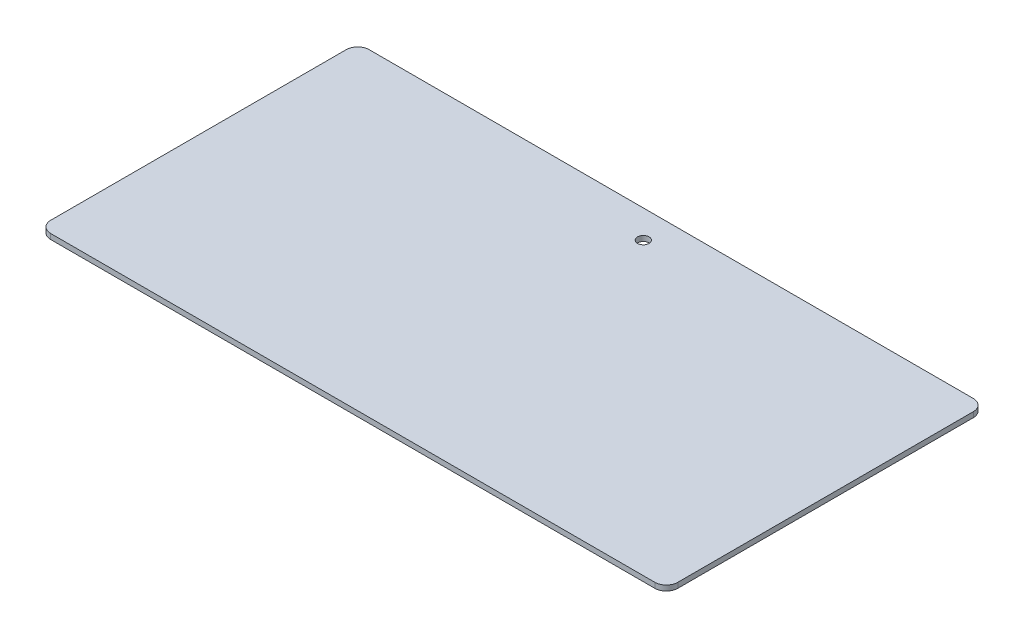
ISO-10303-21;
HEADER;
FILE_DESCRIPTION(('STEP AP214'),'2;1');
FILE_NAME('part.step','',(''),(''),'','','');
FILE_SCHEMA(('AUTOMOTIVE_DESIGN { 1 0 10303 214 1 1 1 1 }'));
ENDSEC;
DATA;
#1=APPLICATION_CONTEXT('core data for automotive mechanical design processes');
#2=APPLICATION_PROTOCOL_DEFINITION('international standard','automotive_design',2000,#1);
#3=PRODUCT_CONTEXT('',#1,'mechanical');
#4=PRODUCT('Part','Part','',(#3));
#5=PRODUCT_RELATED_PRODUCT_CATEGORY('part','',(#4));
#6=PRODUCT_DEFINITION_FORMATION('','',#4);
#7=PRODUCT_DEFINITION_CONTEXT('part definition',#1,'design');
#8=PRODUCT_DEFINITION('design','',#6,#7);
#9=PRODUCT_DEFINITION_SHAPE('','',#8);
#10=(LENGTH_UNIT() NAMED_UNIT(*) SI_UNIT(.MILLI.,.METRE.));
#11=(NAMED_UNIT(*) PLANE_ANGLE_UNIT() SI_UNIT($,.RADIAN.));
#12=(NAMED_UNIT(*) SI_UNIT($,.STERADIAN.) SOLID_ANGLE_UNIT());
#13=UNCERTAINTY_MEASURE_WITH_UNIT(LENGTH_MEASURE(1.E-05),#10,'distance_accuracy_value','');
#14=(GEOMETRIC_REPRESENTATION_CONTEXT(3) GLOBAL_UNCERTAINTY_ASSIGNED_CONTEXT((#13)) GLOBAL_UNIT_ASSIGNED_CONTEXT((#10,
#11,#12)) REPRESENTATION_CONTEXT('',''));
#15=CARTESIAN_POINT('',(0.,0.,0.));
#16=DIRECTION('',(0.,0.,1.));
#17=DIRECTION('',(1.,0.,0.));
#18=AXIS2_PLACEMENT_3D('',#15,#16,#17);
#19=CARTESIAN_POINT('',(229.441389501661,1.6,0.));
#20=DIRECTION('',(0.,0.,-1.));
#21=DIRECTION('',(-1.,0.,0.));
#22=AXIS2_PLACEMENT_3D('',#19,#20,#21);
#23=PLANE('',#22);
#24=DIRECTION('',(1.,0.,0.));
#25=VECTOR('',#24,1.);
#26=CARTESIAN_POINT('',(229.441389501661,1.6,0.));
#27=LINE('',#26,#25);
#28=CARTESIAN_POINT('',(41.9413895016611,1.6,0.));
#29=VERTEX_POINT('',#28);
#30=CARTESIAN_POINT('',(225.941389501661,1.6,0.));
#31=VERTEX_POINT('',#30);
#32=EDGE_CURVE('E128',#29,#31,#27,.T.);
#33=ORIENTED_EDGE('',*,*,#32,.F.);
#34=DIRECTION('',(0.,-1.,0.));
#35=VECTOR('',#34,1.);
#36=CARTESIAN_POINT('',(41.9413895016611,1.6,0.));
#37=LINE('',#36,#35);
#38=CARTESIAN_POINT('',(41.9413895016611,0.,0.));
#39=VERTEX_POINT('',#38);
#40=EDGE_CURVE('E154',#29,#39,#37,.T.);
#41=ORIENTED_EDGE('',*,*,#40,.T.);
#42=DIRECTION('',(1.,0.,0.));
#43=VECTOR('',#42,1.);
#44=CARTESIAN_POINT('',(229.441389501661,0.,0.));
#45=LINE('',#44,#43);
#46=CARTESIAN_POINT('',(225.941389501661,0.,0.));
#47=VERTEX_POINT('',#46);
#48=EDGE_CURVE('E162',#39,#47,#45,.T.);
#49=ORIENTED_EDGE('',*,*,#48,.T.);
#50=DIRECTION('',(0.,-1.,0.));
#51=VECTOR('',#50,1.);
#52=CARTESIAN_POINT('',(225.941389501661,1.6,0.));
#53=LINE('',#52,#51);
#54=EDGE_CURVE('E152',#47,#31,#53,.F.);
#55=ORIENTED_EDGE('',*,*,#54,.T.);
#56=EDGE_LOOP('',(#33,#41,#49,#55));
#57=FACE_BOUND('',#56,.T.);
#58=ADVANCED_FACE('F37',(#57),#23,.F.);
#59=CARTESIAN_POINT('',(229.441389501661,1.6,-97.));
#60=DIRECTION('',(-1.,0.,0.));
#61=DIRECTION('',(0.,0.,1.));
#62=AXIS2_PLACEMENT_3D('',#59,#60,#61);
#63=PLANE('',#62);
#64=DIRECTION('',(0.,0.,-1.));
#65=VECTOR('',#64,1.);
#66=CARTESIAN_POINT('',(229.441389501661,0.,-97.));
#67=LINE('',#66,#65);
#68=CARTESIAN_POINT('',(229.441389501661,0.,-3.50000000000003));
#69=VERTEX_POINT('',#68);
#70=CARTESIAN_POINT('',(229.441389501661,0.,-93.5));
#71=VERTEX_POINT('',#70);
#72=EDGE_CURVE('E133',#69,#71,#67,.T.);
#73=ORIENTED_EDGE('',*,*,#72,.T.);
#74=DIRECTION('',(0.,-1.,0.));
#75=VECTOR('',#74,1.);
#76=CARTESIAN_POINT('',(229.441389501661,1.6,-93.5));
#77=LINE('',#76,#75);
#78=CARTESIAN_POINT('',(229.441389501661,1.6,-93.5));
#79=VERTEX_POINT('',#78);
#80=EDGE_CURVE('E11',#71,#79,#77,.F.);
#81=ORIENTED_EDGE('',*,*,#80,.T.);
#82=DIRECTION('',(0.,0.,-1.));
#83=VECTOR('',#82,1.);
#84=CARTESIAN_POINT('',(229.441389501661,1.6,-97.));
#85=LINE('',#84,#83);
#86=CARTESIAN_POINT('',(229.441389501661,1.6,-3.50000000000003));
#87=VERTEX_POINT('',#86);
#88=EDGE_CURVE('E131',#87,#79,#85,.T.);
#89=ORIENTED_EDGE('',*,*,#88,.F.);
#90=DIRECTION('',(0.,-1.,0.));
#91=VECTOR('',#90,1.);
#92=CARTESIAN_POINT('',(229.441389501661,1.6,-3.5));
#93=LINE('',#92,#91);
#94=EDGE_CURVE('E45',#87,#69,#93,.T.);
#95=ORIENTED_EDGE('',*,*,#94,.T.);
#96=EDGE_LOOP('',(#73,#81,#89,#95));
#97=FACE_BOUND('',#96,.T.);
#98=ADVANCED_FACE('F159',(#97),#63,.F.);
#99=CARTESIAN_POINT('',(38.4413895016611,1.6,-97.));
#100=DIRECTION('',(0.,0.,1.));
#101=DIRECTION('',(1.,0.,0.));
#102=AXIS2_PLACEMENT_3D('',#99,#100,#101);
#103=PLANE('',#102);
#104=DIRECTION('',(-1.,0.,0.));
#105=VECTOR('',#104,1.);
#106=CARTESIAN_POINT('',(38.4413895016611,0.,-97.));
#107=LINE('',#106,#105);
#108=CARTESIAN_POINT('',(225.941389501661,0.,-97.));
#109=VERTEX_POINT('',#108);
#110=CARTESIAN_POINT('',(41.9413895016611,0.,-97.));
#111=VERTEX_POINT('',#110);
#112=EDGE_CURVE('E129',#109,#111,#107,.T.);
#113=ORIENTED_EDGE('',*,*,#112,.T.);
#114=DIRECTION('',(0.,-1.,0.));
#115=VECTOR('',#114,1.);
#116=CARTESIAN_POINT('',(41.9413895016611,1.6,-97.));
#117=LINE('',#116,#115);
#118=CARTESIAN_POINT('',(41.9413895016611,1.6,-97.));
#119=VERTEX_POINT('',#118);
#120=EDGE_CURVE('E107',#111,#119,#117,.F.);
#121=ORIENTED_EDGE('',*,*,#120,.T.);
#122=DIRECTION('',(-1.,0.,0.));
#123=VECTOR('',#122,1.);
#124=CARTESIAN_POINT('',(38.4413895016611,1.6,-97.));
#125=LINE('',#124,#123);
#126=CARTESIAN_POINT('',(225.941389501661,1.6,-97.));
#127=VERTEX_POINT('',#126);
#128=EDGE_CURVE('E167',#127,#119,#125,.T.);
#129=ORIENTED_EDGE('',*,*,#128,.F.);
#130=DIRECTION('',(0.,-1.,0.));
#131=VECTOR('',#130,1.);
#132=CARTESIAN_POINT('',(225.941389501661,1.6,-97.));
#133=LINE('',#132,#131);
#134=EDGE_CURVE('E112',#127,#109,#133,.T.);
#135=ORIENTED_EDGE('',*,*,#134,.T.);
#136=EDGE_LOOP('',(#113,#121,#129,#135));
#137=FACE_BOUND('',#136,.T.);
#138=ADVANCED_FACE('F191',(#137),#103,.F.);
#139=CARTESIAN_POINT('',(38.4413895016611,1.6,0.));
#140=DIRECTION('',(1.,0.,0.));
#141=DIRECTION('',(0.,0.,-1.));
#142=AXIS2_PLACEMENT_3D('',#139,#140,#141);
#143=PLANE('',#142);
#144=DIRECTION('',(0.,0.,1.));
#145=VECTOR('',#144,1.);
#146=CARTESIAN_POINT('',(38.4413895016611,1.6,0.));
#147=LINE('',#146,#145);
#148=CARTESIAN_POINT('',(38.4413895016611,1.6,-93.5));
#149=VERTEX_POINT('',#148);
#150=CARTESIAN_POINT('',(38.4413895016611,1.6,-3.5));
#151=VERTEX_POINT('',#150);
#152=EDGE_CURVE('E122',#149,#151,#147,.T.);
#153=ORIENTED_EDGE('',*,*,#152,.F.);
#154=DIRECTION('',(0.,-1.,0.));
#155=VECTOR('',#154,1.);
#156=CARTESIAN_POINT('',(38.4413895016611,1.6,-93.5));
#157=LINE('',#156,#155);
#158=CARTESIAN_POINT('',(38.4413895016611,0.,-93.5));
#159=VERTEX_POINT('',#158);
#160=EDGE_CURVE('E106',#149,#159,#157,.T.);
#161=ORIENTED_EDGE('',*,*,#160,.T.);
#162=DIRECTION('',(0.,0.,1.));
#163=VECTOR('',#162,1.);
#164=CARTESIAN_POINT('',(38.4413895016611,0.,0.));
#165=LINE('',#164,#163);
#166=CARTESIAN_POINT('',(38.4413895016611,0.,-3.5));
#167=VERTEX_POINT('',#166);
#168=EDGE_CURVE('E119',#159,#167,#165,.T.);
#169=ORIENTED_EDGE('',*,*,#168,.T.);
#170=DIRECTION('',(0.,-1.,0.));
#171=VECTOR('',#170,1.);
#172=CARTESIAN_POINT('',(38.4413895016611,1.6,-3.5));
#173=LINE('',#172,#171);
#174=EDGE_CURVE('E124',#167,#151,#173,.F.);
#175=ORIENTED_EDGE('',*,*,#174,.T.);
#176=EDGE_LOOP('',(#153,#161,#169,#175));
#177=FACE_BOUND('',#176,.T.);
#178=ADVANCED_FACE('F118',(#177),#143,.F.);
#179=CARTESIAN_POINT('',(0.,1.6,0.));
#180=DIRECTION('',(0.,-1.,0.));
#181=DIRECTION('',(0.,0.,-1.));
#182=AXIS2_PLACEMENT_3D('',#179,#180,#181);
#183=PLANE('',#182);
#184=CARTESIAN_POINT('',(133.941389501661,1.6,-88.5));
#185=DIRECTION('',(0.,1.,0.));
#186=DIRECTION('',(0.,0.,1.));
#187=AXIS2_PLACEMENT_3D('',#184,#185,#186);
#188=CIRCLE('',#187,1.75000000000001);
#189=CARTESIAN_POINT('',(133.941389501661,1.6,-86.75));
#190=VERTEX_POINT('',#189);
#191=EDGE_CURVE('E171',#190,#190,#188,.T.);
#192=ORIENTED_EDGE('',*,*,#191,.F.);
#193=EDGE_LOOP('',(#192));
#194=FACE_BOUND('',#193,.T.);
#195=ORIENTED_EDGE('',*,*,#128,.T.);
#196=CARTESIAN_POINT('',(41.9413895016611,1.6,-93.5));
#197=DIRECTION('',(0.,-1.,0.));
#198=DIRECTION('',(0.,0.,-1.));
#199=AXIS2_PLACEMENT_3D('',#196,#197,#198);
#200=CIRCLE('',#199,3.5);
#201=EDGE_CURVE('E150',#119,#149,#200,.F.);
#202=ORIENTED_EDGE('',*,*,#201,.T.);
#203=ORIENTED_EDGE('',*,*,#152,.T.);
#204=CARTESIAN_POINT('',(41.9413895016611,1.6,-3.5));
#205=DIRECTION('',(0.,-1.,0.));
#206=DIRECTION('',(0.,0.,-1.));
#207=AXIS2_PLACEMENT_3D('',#204,#205,#206);
#208=CIRCLE('',#207,3.5);
#209=EDGE_CURVE('E148',#151,#29,#208,.F.);
#210=ORIENTED_EDGE('',*,*,#209,.T.);
#211=ORIENTED_EDGE('',*,*,#32,.T.);
#212=CARTESIAN_POINT('',(225.941389501661,1.6,-3.5));
#213=DIRECTION('',(0.,-1.,0.));
#214=DIRECTION('',(0.,0.,-1.));
#215=AXIS2_PLACEMENT_3D('',#212,#213,#214);
#216=CIRCLE('',#215,3.5);
#217=EDGE_CURVE('E57',#31,#87,#216,.F.);
#218=ORIENTED_EDGE('',*,*,#217,.T.);
#219=ORIENTED_EDGE('',*,*,#88,.T.);
#220=CARTESIAN_POINT('',(225.941389501661,1.6,-93.5));
#221=DIRECTION('',(0.,-1.,0.));
#222=DIRECTION('',(0.,0.,-1.));
#223=AXIS2_PLACEMENT_3D('',#220,#221,#222);
#224=CIRCLE('',#223,3.5);
#225=EDGE_CURVE('E146',#79,#127,#224,.F.);
#226=ORIENTED_EDGE('',*,*,#225,.T.);
#227=EDGE_LOOP('',(#195,#202,#203,#210,#211,#218,#219,#226));
#228=FACE_BOUND('',#227,.T.);
#229=ADVANCED_FACE('F184',(#194,#228),#183,.F.);
#230=CARTESIAN_POINT('',(0.,0.,0.));
#231=DIRECTION('',(0.,-1.,0.));
#232=DIRECTION('',(0.,0.,-1.));
#233=AXIS2_PLACEMENT_3D('',#230,#231,#232);
#234=PLANE('',#233);
#235=CARTESIAN_POINT('',(133.941389501661,0.,-88.5));
#236=DIRECTION('',(0.,1.,0.));
#237=DIRECTION('',(0.,0.,1.));
#238=AXIS2_PLACEMENT_3D('',#235,#236,#237);
#239=CIRCLE('',#238,1.75000000000001);
#240=CARTESIAN_POINT('',(133.941389501661,0.,-86.75));
#241=VERTEX_POINT('',#240);
#242=EDGE_CURVE('E163',#241,#241,#239,.T.);
#243=ORIENTED_EDGE('',*,*,#242,.T.);
#244=EDGE_LOOP('',(#243));
#245=FACE_BOUND('',#244,.T.);
#246=ORIENTED_EDGE('',*,*,#168,.F.);
#247=CARTESIAN_POINT('',(41.9413895016611,0.,-93.5));
#248=DIRECTION('',(0.,-1.,0.));
#249=DIRECTION('',(0.,0.,-1.));
#250=AXIS2_PLACEMENT_3D('',#247,#248,#249);
#251=CIRCLE('',#250,3.5);
#252=EDGE_CURVE('E102',#159,#111,#251,.T.);
#253=ORIENTED_EDGE('',*,*,#252,.T.);
#254=ORIENTED_EDGE('',*,*,#112,.F.);
#255=CARTESIAN_POINT('',(225.941389501661,0.,-93.5));
#256=DIRECTION('',(0.,-1.,0.));
#257=DIRECTION('',(0.,0.,-1.));
#258=AXIS2_PLACEMENT_3D('',#255,#256,#257);
#259=CIRCLE('',#258,3.5);
#260=EDGE_CURVE('E139',#109,#71,#259,.T.);
#261=ORIENTED_EDGE('',*,*,#260,.T.);
#262=ORIENTED_EDGE('',*,*,#72,.F.);
#263=CARTESIAN_POINT('',(225.941389501661,0.,-3.5));
#264=DIRECTION('',(0.,-1.,0.));
#265=DIRECTION('',(0.,0.,-1.));
#266=AXIS2_PLACEMENT_3D('',#263,#264,#265);
#267=CIRCLE('',#266,3.5);
#268=EDGE_CURVE('E123',#69,#47,#267,.T.);
#269=ORIENTED_EDGE('',*,*,#268,.T.);
#270=ORIENTED_EDGE('',*,*,#48,.F.);
#271=CARTESIAN_POINT('',(41.9413895016611,0.,-3.5));
#272=DIRECTION('',(0.,-1.,0.));
#273=DIRECTION('',(0.,0.,-1.));
#274=AXIS2_PLACEMENT_3D('',#271,#272,#273);
#275=CIRCLE('',#274,3.5);
#276=EDGE_CURVE('E113',#39,#167,#275,.T.);
#277=ORIENTED_EDGE('',*,*,#276,.T.);
#278=EDGE_LOOP('',(#246,#253,#254,#261,#262,#269,#270,#277));
#279=FACE_BOUND('',#278,.T.);
#280=ADVANCED_FACE('F126',(#245,#279),#234,.T.);
#281=CARTESIAN_POINT('',(41.9413895016611,1.6,-93.5));
#282=DIRECTION('',(0.,-1.,0.));
#283=DIRECTION('',(0.,0.,-1.));
#284=AXIS2_PLACEMENT_3D('',#281,#282,#283);
#285=CYLINDRICAL_SURFACE('',#284,3.5);
#286=ORIENTED_EDGE('',*,*,#201,.F.);
#287=ORIENTED_EDGE('',*,*,#120,.F.);
#288=ORIENTED_EDGE('',*,*,#252,.F.);
#289=ORIENTED_EDGE('',*,*,#160,.F.);
#290=EDGE_LOOP('',(#286,#287,#288,#289));
#291=FACE_BOUND('',#290,.T.);
#292=ADVANCED_FACE('F105',(#291),#285,.T.);
#293=CARTESIAN_POINT('',(41.9413895016611,1.6,-3.5));
#294=DIRECTION('',(0.,-1.,0.));
#295=DIRECTION('',(0.,0.,-1.));
#296=AXIS2_PLACEMENT_3D('',#293,#294,#295);
#297=CYLINDRICAL_SURFACE('',#296,3.5);
#298=ORIENTED_EDGE('',*,*,#209,.F.);
#299=ORIENTED_EDGE('',*,*,#174,.F.);
#300=ORIENTED_EDGE('',*,*,#276,.F.);
#301=ORIENTED_EDGE('',*,*,#40,.F.);
#302=EDGE_LOOP('',(#298,#299,#300,#301));
#303=FACE_BOUND('',#302,.T.);
#304=ADVANCED_FACE('F195',(#303),#297,.T.);
#305=CARTESIAN_POINT('',(225.941389501661,1.6,-93.5));
#306=DIRECTION('',(0.,-1.,0.));
#307=DIRECTION('',(0.,0.,-1.));
#308=AXIS2_PLACEMENT_3D('',#305,#306,#307);
#309=CYLINDRICAL_SURFACE('',#308,3.5);
#310=ORIENTED_EDGE('',*,*,#225,.F.);
#311=ORIENTED_EDGE('',*,*,#80,.F.);
#312=ORIENTED_EDGE('',*,*,#260,.F.);
#313=ORIENTED_EDGE('',*,*,#134,.F.);
#314=EDGE_LOOP('',(#310,#311,#312,#313));
#315=FACE_BOUND('',#314,.T.);
#316=ADVANCED_FACE('F193',(#315),#309,.T.);
#317=CARTESIAN_POINT('',(225.941389501661,1.6,-3.5));
#318=DIRECTION('',(0.,-1.,0.));
#319=DIRECTION('',(0.,0.,-1.));
#320=AXIS2_PLACEMENT_3D('',#317,#318,#319);
#321=CYLINDRICAL_SURFACE('',#320,3.5);
#322=ORIENTED_EDGE('',*,*,#217,.F.);
#323=ORIENTED_EDGE('',*,*,#54,.F.);
#324=ORIENTED_EDGE('',*,*,#268,.F.);
#325=ORIENTED_EDGE('',*,*,#94,.F.);
#326=EDGE_LOOP('',(#322,#323,#324,#325));
#327=FACE_BOUND('',#326,.T.);
#328=ADVANCED_FACE('F39',(#327),#321,.T.);
#329=CARTESIAN_POINT('',(133.941389501661,0.,-88.5));
#330=DIRECTION('',(0.,1.,0.));
#331=DIRECTION('',(0.,0.,1.));
#332=AXIS2_PLACEMENT_3D('',#329,#330,#331);
#333=CYLINDRICAL_SURFACE('',#332,1.75000000000001);
#334=ORIENTED_EDGE('',*,*,#242,.F.);
#335=EDGE_LOOP('',(#334));
#336=FACE_BOUND('',#335,.T.);
#337=ORIENTED_EDGE('',*,*,#191,.T.);
#338=EDGE_LOOP('',(#337));
#339=FACE_BOUND('',#338,.T.);
#340=ADVANCED_FACE('F178',(#336,#339),#333,.F.);
#341=CLOSED_SHELL('',(#58,#98,#138,#178,#229,#280,#292,#304,#316,#328,#340));
#342=MANIFOLD_SOLID_BREP('B2',#341);
#343=ADVANCED_BREP_SHAPE_REPRESENTATION('',(#18,#342),#14);
#344=SHAPE_DEFINITION_REPRESENTATION(#9,#343);
ENDSEC;
END-ISO-10303-21;
